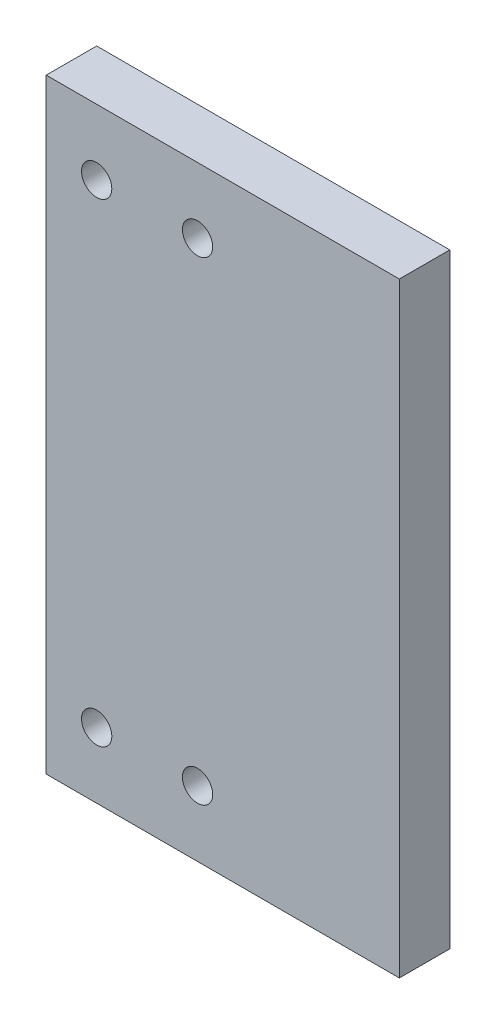
ISO-10303-21;
HEADER;
FILE_DESCRIPTION(('STEP AP214'),'2;1');
FILE_NAME('part.step','',(''),(''),'','','');
FILE_SCHEMA(('AUTOMOTIVE_DESIGN { 1 0 10303 214 1 1 1 1 }'));
ENDSEC;
DATA;
#1=APPLICATION_CONTEXT('core data for automotive mechanical design processes');
#2=APPLICATION_PROTOCOL_DEFINITION('international standard','automotive_design',2000,#1);
#3=PRODUCT_CONTEXT('',#1,'mechanical');
#4=PRODUCT('Part','Part','',(#3));
#5=PRODUCT_RELATED_PRODUCT_CATEGORY('part','',(#4));
#6=PRODUCT_DEFINITION_FORMATION('','',#4);
#7=PRODUCT_DEFINITION_CONTEXT('part definition',#1,'design');
#8=PRODUCT_DEFINITION('design','',#6,#7);
#9=PRODUCT_DEFINITION_SHAPE('','',#8);
#10=(LENGTH_UNIT() NAMED_UNIT(*) SI_UNIT(.MILLI.,.METRE.));
#11=(NAMED_UNIT(*) PLANE_ANGLE_UNIT() SI_UNIT($,.RADIAN.));
#12=(NAMED_UNIT(*) SI_UNIT($,.STERADIAN.) SOLID_ANGLE_UNIT());
#13=UNCERTAINTY_MEASURE_WITH_UNIT(LENGTH_MEASURE(1.E-05),#10,'distance_accuracy_value','');
#14=(GEOMETRIC_REPRESENTATION_CONTEXT(3) GLOBAL_UNCERTAINTY_ASSIGNED_CONTEXT((#13)) GLOBAL_UNIT_ASSIGNED_CONTEXT((#10,
#11,#12)) REPRESENTATION_CONTEXT('',''));
#15=CARTESIAN_POINT('',(0.,0.,0.));
#16=DIRECTION('',(0.,0.,1.));
#17=DIRECTION('',(1.,0.,0.));
#18=AXIS2_PLACEMENT_3D('',#15,#16,#17);
#19=CARTESIAN_POINT('',(0.,0.,5.));
#20=DIRECTION('',(0.,0.,-1.));
#21=DIRECTION('',(-1.,0.,0.));
#22=AXIS2_PLACEMENT_3D('',#19,#20,#21);
#23=PLANE('',#22);
#24=CARTESIAN_POINT('',(15.,6.5,5.));
#25=DIRECTION('',(0.,0.,1.));
#26=DIRECTION('',(1.,0.,0.));
#27=AXIS2_PLACEMENT_3D('',#24,#25,#26);
#28=CIRCLE('',#27,1.5);
#29=CARTESIAN_POINT('',(16.5,6.5,5.));
#30=VERTEX_POINT('',#29);
#31=EDGE_CURVE('E157',#30,#30,#28,.T.);
#32=ORIENTED_EDGE('',*,*,#31,.F.);
#33=EDGE_LOOP('',(#32));
#34=FACE_BOUND('',#33,.T.);
#35=CARTESIAN_POINT('',(5.,53.5,5.));
#36=DIRECTION('',(0.,0.,1.));
#37=DIRECTION('',(1.,0.,0.));
#38=AXIS2_PLACEMENT_3D('',#35,#36,#37);
#39=CIRCLE('',#38,1.5);
#40=CARTESIAN_POINT('',(6.5,53.5,5.));
#41=VERTEX_POINT('',#40);
#42=EDGE_CURVE('E99',#41,#41,#39,.T.);
#43=ORIENTED_EDGE('',*,*,#42,.F.);
#44=EDGE_LOOP('',(#43));
#45=FACE_BOUND('',#44,.T.);
#46=DIRECTION('',(0.,-1.,0.));
#47=VECTOR('',#46,1.);
#48=CARTESIAN_POINT('',(0.,0.,5.));
#49=LINE('',#48,#47);
#50=CARTESIAN_POINT('',(0.,60.,5.));
#51=VERTEX_POINT('',#50);
#52=CARTESIAN_POINT('',(0.,0.,5.));
#53=VERTEX_POINT('',#52);
#54=EDGE_CURVE('E50',#51,#53,#49,.T.);
#55=ORIENTED_EDGE('',*,*,#54,.T.);
#56=DIRECTION('',(1.,0.,0.));
#57=VECTOR('',#56,1.);
#58=CARTESIAN_POINT('',(0.,0.,5.));
#59=LINE('',#58,#57);
#60=CARTESIAN_POINT('',(35.,0.,5.));
#61=VERTEX_POINT('',#60);
#62=EDGE_CURVE('E82',#53,#61,#59,.T.);
#63=ORIENTED_EDGE('',*,*,#62,.T.);
#64=DIRECTION('',(0.,1.,0.));
#65=VECTOR('',#64,1.);
#66=CARTESIAN_POINT('',(35.,0.,5.));
#67=LINE('',#66,#65);
#68=CARTESIAN_POINT('',(35.,60.,5.));
#69=VERTEX_POINT('',#68);
#70=EDGE_CURVE('E86',#61,#69,#67,.T.);
#71=ORIENTED_EDGE('',*,*,#70,.T.);
#72=DIRECTION('',(-1.,0.,0.));
#73=VECTOR('',#72,1.);
#74=CARTESIAN_POINT('',(0.,60.,5.));
#75=LINE('',#74,#73);
#76=EDGE_CURVE('E92',#69,#51,#75,.T.);
#77=ORIENTED_EDGE('',*,*,#76,.T.);
#78=EDGE_LOOP('',(#55,#63,#71,#77));
#79=FACE_BOUND('',#78,.T.);
#80=CARTESIAN_POINT('',(15.,53.5,5.));
#81=DIRECTION('',(0.,0.,1.));
#82=DIRECTION('',(-1.,0.,0.));
#83=AXIS2_PLACEMENT_3D('',#80,#81,#82);
#84=CIRCLE('',#83,1.5);
#85=CARTESIAN_POINT('',(13.5,53.5,5.));
#86=VERTEX_POINT('',#85);
#87=EDGE_CURVE('E163',#86,#86,#84,.T.);
#88=ORIENTED_EDGE('',*,*,#87,.F.);
#89=EDGE_LOOP('',(#88));
#90=FACE_BOUND('',#89,.T.);
#91=CARTESIAN_POINT('',(5.,6.5,5.));
#92=DIRECTION('',(0.,0.,1.));
#93=DIRECTION('',(-1.,0.,0.));
#94=AXIS2_PLACEMENT_3D('',#91,#92,#93);
#95=CIRCLE('',#94,1.5);
#96=CARTESIAN_POINT('',(3.5,6.5,5.));
#97=VERTEX_POINT('',#96);
#98=EDGE_CURVE('E148',#97,#97,#95,.T.);
#99=ORIENTED_EDGE('',*,*,#98,.F.);
#100=EDGE_LOOP('',(#99));
#101=FACE_BOUND('',#100,.T.);
#102=ADVANCED_FACE('F33',(#34,#45,#79,#90,#101),#23,.F.);
#103=CARTESIAN_POINT('',(0.,0.,0.));
#104=DIRECTION('',(0.,0.,-1.));
#105=DIRECTION('',(-1.,0.,0.));
#106=AXIS2_PLACEMENT_3D('',#103,#104,#105);
#107=PLANE('',#106);
#108=CARTESIAN_POINT('',(15.,6.5,0.));
#109=DIRECTION('',(0.,0.,1.));
#110=DIRECTION('',(1.,0.,0.));
#111=AXIS2_PLACEMENT_3D('',#108,#109,#110);
#112=CIRCLE('',#111,1.5);
#113=CARTESIAN_POINT('',(16.5,6.5,0.));
#114=VERTEX_POINT('',#113);
#115=EDGE_CURVE('E154',#114,#114,#112,.T.);
#116=ORIENTED_EDGE('',*,*,#115,.T.);
#117=EDGE_LOOP('',(#116));
#118=FACE_BOUND('',#117,.T.);
#119=CARTESIAN_POINT('',(5.,53.5,0.));
#120=DIRECTION('',(0.,0.,1.));
#121=DIRECTION('',(1.,0.,0.));
#122=AXIS2_PLACEMENT_3D('',#119,#120,#121);
#123=CIRCLE('',#122,1.5);
#124=CARTESIAN_POINT('',(6.5,53.5,0.));
#125=VERTEX_POINT('',#124);
#126=EDGE_CURVE('E166',#125,#125,#123,.T.);
#127=ORIENTED_EDGE('',*,*,#126,.T.);
#128=EDGE_LOOP('',(#127));
#129=FACE_BOUND('',#128,.T.);
#130=DIRECTION('',(1.,0.,0.));
#131=VECTOR('',#130,1.);
#132=CARTESIAN_POINT('',(0.,0.,0.));
#133=LINE('',#132,#131);
#134=CARTESIAN_POINT('',(0.,0.,0.));
#135=VERTEX_POINT('',#134);
#136=CARTESIAN_POINT('',(35.,0.,0.));
#137=VERTEX_POINT('',#136);
#138=EDGE_CURVE('E88',#135,#137,#133,.T.);
#139=ORIENTED_EDGE('',*,*,#138,.F.);
#140=DIRECTION('',(0.,-1.,0.));
#141=VECTOR('',#140,1.);
#142=CARTESIAN_POINT('',(0.,50.,0.));
#143=LINE('',#142,#141);
#144=CARTESIAN_POINT('',(0.,60.,0.));
#145=VERTEX_POINT('',#144);
#146=EDGE_CURVE('E75',#145,#135,#143,.T.);
#147=ORIENTED_EDGE('',*,*,#146,.F.);
#148=DIRECTION('',(-1.,0.,0.));
#149=VECTOR('',#148,1.);
#150=CARTESIAN_POINT('',(0.,60.,0.));
#151=LINE('',#150,#149);
#152=CARTESIAN_POINT('',(35.,60.,0.));
#153=VERTEX_POINT('',#152);
#154=EDGE_CURVE('E101',#153,#145,#151,.T.);
#155=ORIENTED_EDGE('',*,*,#154,.F.);
#156=DIRECTION('',(0.,1.,0.));
#157=VECTOR('',#156,1.);
#158=CARTESIAN_POINT('',(35.,0.,0.));
#159=LINE('',#158,#157);
#160=EDGE_CURVE('E68',#137,#153,#159,.T.);
#161=ORIENTED_EDGE('',*,*,#160,.F.);
#162=EDGE_LOOP('',(#139,#147,#155,#161));
#163=FACE_BOUND('',#162,.T.);
#164=CARTESIAN_POINT('',(15.,53.5,0.));
#165=DIRECTION('',(0.,0.,1.));
#166=DIRECTION('',(-1.,0.,0.));
#167=AXIS2_PLACEMENT_3D('',#164,#165,#166);
#168=CIRCLE('',#167,1.5);
#169=CARTESIAN_POINT('',(13.5,53.5,0.));
#170=VERTEX_POINT('',#169);
#171=EDGE_CURVE('E160',#170,#170,#168,.T.);
#172=ORIENTED_EDGE('',*,*,#171,.T.);
#173=EDGE_LOOP('',(#172));
#174=FACE_BOUND('',#173,.T.);
#175=CARTESIAN_POINT('',(5.,6.5,0.));
#176=DIRECTION('',(0.,0.,1.));
#177=DIRECTION('',(-1.,0.,0.));
#178=AXIS2_PLACEMENT_3D('',#175,#176,#177);
#179=CIRCLE('',#178,1.5);
#180=CARTESIAN_POINT('',(3.5,6.5,0.));
#181=VERTEX_POINT('',#180);
#182=EDGE_CURVE('E151',#181,#181,#179,.T.);
#183=ORIENTED_EDGE('',*,*,#182,.T.);
#184=EDGE_LOOP('',(#183));
#185=FACE_BOUND('',#184,.T.);
#186=ADVANCED_FACE('F108',(#118,#129,#163,#174,#185),#107,.T.);
#187=CARTESIAN_POINT('',(0.,0.,5.));
#188=DIRECTION('',(0.,1.,0.));
#189=DIRECTION('',(0.,0.,1.));
#190=AXIS2_PLACEMENT_3D('',#187,#188,#189);
#191=PLANE('',#190);
#192=ORIENTED_EDGE('',*,*,#138,.T.);
#193=DIRECTION('',(0.,0.,-1.));
#194=VECTOR('',#193,1.);
#195=CARTESIAN_POINT('',(35.,0.,5.));
#196=LINE('',#195,#194);
#197=EDGE_CURVE('E42',#61,#137,#196,.T.);
#198=ORIENTED_EDGE('',*,*,#197,.F.);
#199=ORIENTED_EDGE('',*,*,#62,.F.);
#200=DIRECTION('',(0.,0.,-1.));
#201=VECTOR('',#200,1.);
#202=CARTESIAN_POINT('',(0.,0.,5.));
#203=LINE('',#202,#201);
#204=EDGE_CURVE('E11',#53,#135,#203,.T.);
#205=ORIENTED_EDGE('',*,*,#204,.T.);
#206=EDGE_LOOP('',(#192,#198,#199,#205));
#207=FACE_BOUND('',#206,.T.);
#208=ADVANCED_FACE('F35',(#207),#191,.F.);
#209=CARTESIAN_POINT('',(35.,0.,5.));
#210=DIRECTION('',(-1.,0.,0.));
#211=DIRECTION('',(0.,0.,1.));
#212=AXIS2_PLACEMENT_3D('',#209,#210,#211);
#213=PLANE('',#212);
#214=ORIENTED_EDGE('',*,*,#160,.T.);
#215=DIRECTION('',(0.,0.,-1.));
#216=VECTOR('',#215,1.);
#217=CARTESIAN_POINT('',(35.,60.,5.));
#218=LINE('',#217,#216);
#219=EDGE_CURVE('E89',#69,#153,#218,.T.);
#220=ORIENTED_EDGE('',*,*,#219,.F.);
#221=ORIENTED_EDGE('',*,*,#70,.F.);
#222=ORIENTED_EDGE('',*,*,#197,.T.);
#223=EDGE_LOOP('',(#214,#220,#221,#222));
#224=FACE_BOUND('',#223,.T.);
#225=ADVANCED_FACE('F90',(#224),#213,.F.);
#226=CARTESIAN_POINT('',(0.,60.,5.));
#227=DIRECTION('',(0.,-1.,0.));
#228=DIRECTION('',(0.,0.,-1.));
#229=AXIS2_PLACEMENT_3D('',#226,#227,#228);
#230=PLANE('',#229);
#231=ORIENTED_EDGE('',*,*,#154,.T.);
#232=DIRECTION('',(0.,0.,-1.));
#233=VECTOR('',#232,1.);
#234=CARTESIAN_POINT('',(0.,60.,5.));
#235=LINE('',#234,#233);
#236=EDGE_CURVE('E94',#51,#145,#235,.T.);
#237=ORIENTED_EDGE('',*,*,#236,.F.);
#238=ORIENTED_EDGE('',*,*,#76,.F.);
#239=ORIENTED_EDGE('',*,*,#219,.T.);
#240=EDGE_LOOP('',(#231,#237,#238,#239));
#241=FACE_BOUND('',#240,.T.);
#242=ADVANCED_FACE('F106',(#241),#230,.F.);
#243=CARTESIAN_POINT('',(0.,50.,5.));
#244=DIRECTION('',(1.,0.,0.));
#245=DIRECTION('',(0.,0.,-1.));
#246=AXIS2_PLACEMENT_3D('',#243,#244,#245);
#247=PLANE('',#246);
#248=ORIENTED_EDGE('',*,*,#146,.T.);
#249=ORIENTED_EDGE('',*,*,#204,.F.);
#250=ORIENTED_EDGE('',*,*,#54,.F.);
#251=ORIENTED_EDGE('',*,*,#236,.T.);
#252=EDGE_LOOP('',(#248,#249,#250,#251));
#253=FACE_BOUND('',#252,.T.);
#254=ADVANCED_FACE('F110',(#253),#247,.F.);
#255=CARTESIAN_POINT('',(5.,53.5,5.));
#256=DIRECTION('',(0.,0.,-1.));
#257=DIRECTION('',(-1.,0.,0.));
#258=AXIS2_PLACEMENT_3D('',#255,#256,#257);
#259=CYLINDRICAL_SURFACE('',#258,1.5);
#260=ORIENTED_EDGE('',*,*,#42,.T.);
#261=EDGE_LOOP('',(#260));
#262=FACE_BOUND('',#261,.T.);
#263=ORIENTED_EDGE('',*,*,#126,.F.);
#264=EDGE_LOOP('',(#263));
#265=FACE_BOUND('',#264,.T.);
#266=ADVANCED_FACE('F112',(#262,#265),#259,.F.);
#267=CARTESIAN_POINT('',(15.,53.5,5.));
#268=DIRECTION('',(0.,0.,-1.));
#269=DIRECTION('',(-1.,0.,0.));
#270=AXIS2_PLACEMENT_3D('',#267,#268,#269);
#271=CYLINDRICAL_SURFACE('',#270,1.5);
#272=ORIENTED_EDGE('',*,*,#87,.T.);
#273=EDGE_LOOP('',(#272));
#274=FACE_BOUND('',#273,.T.);
#275=ORIENTED_EDGE('',*,*,#171,.F.);
#276=EDGE_LOOP('',(#275));
#277=FACE_BOUND('',#276,.T.);
#278=ADVANCED_FACE('F118',(#274,#277),#271,.F.);
#279=CARTESIAN_POINT('',(15.,6.5,5.));
#280=DIRECTION('',(0.,0.,-1.));
#281=DIRECTION('',(-1.,0.,0.));
#282=AXIS2_PLACEMENT_3D('',#279,#280,#281);
#283=CYLINDRICAL_SURFACE('',#282,1.5);
#284=ORIENTED_EDGE('',*,*,#31,.T.);
#285=EDGE_LOOP('',(#284));
#286=FACE_BOUND('',#285,.T.);
#287=ORIENTED_EDGE('',*,*,#115,.F.);
#288=EDGE_LOOP('',(#287));
#289=FACE_BOUND('',#288,.T.);
#290=ADVANCED_FACE('F135',(#286,#289),#283,.F.);
#291=CARTESIAN_POINT('',(5.,6.5,5.));
#292=DIRECTION('',(0.,0.,-1.));
#293=DIRECTION('',(-1.,0.,0.));
#294=AXIS2_PLACEMENT_3D('',#291,#292,#293);
#295=CYLINDRICAL_SURFACE('',#294,1.5);
#296=ORIENTED_EDGE('',*,*,#98,.T.);
#297=EDGE_LOOP('',(#296));
#298=FACE_BOUND('',#297,.T.);
#299=ORIENTED_EDGE('',*,*,#182,.F.);
#300=EDGE_LOOP('',(#299));
#301=FACE_BOUND('',#300,.T.);
#302=ADVANCED_FACE('F139',(#298,#301),#295,.F.);
#303=CLOSED_SHELL('',(#102,#186,#208,#225,#242,#254,#266,#278,#290,#302));
#304=MANIFOLD_SOLID_BREP('B2',#303);
#305=ADVANCED_BREP_SHAPE_REPRESENTATION('',(#18,#304),#14);
#306=SHAPE_DEFINITION_REPRESENTATION(#9,#305);
ENDSEC;
END-ISO-10303-21;
